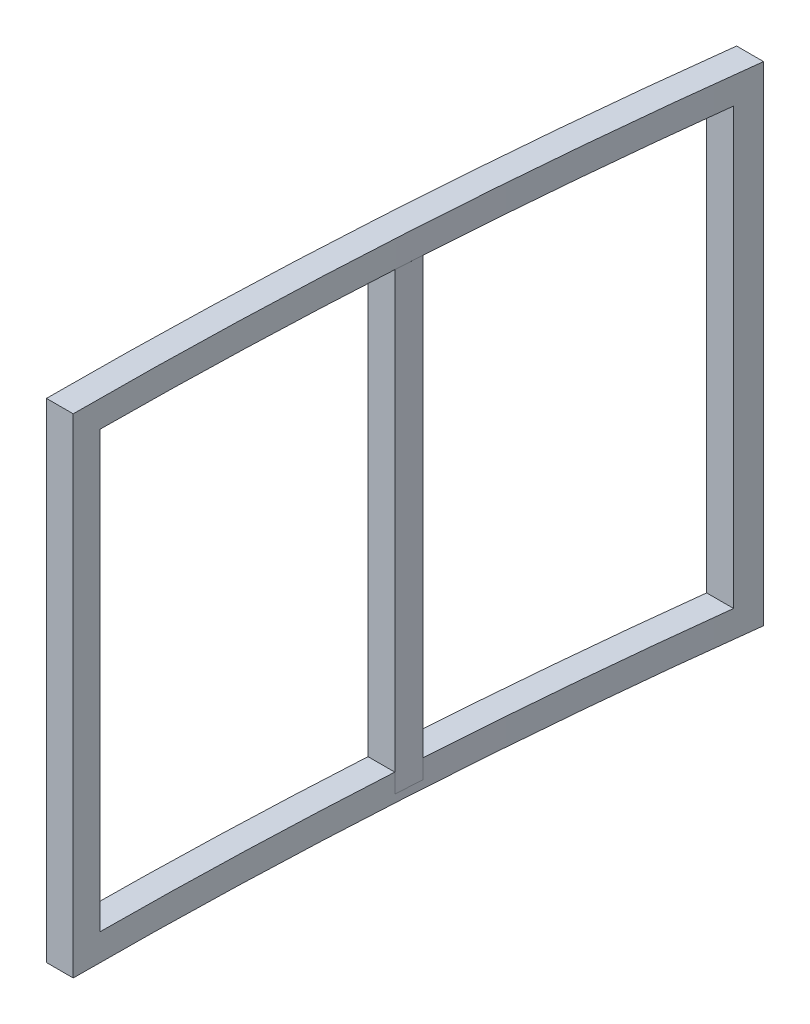
ISO-10303-21;
HEADER;
FILE_DESCRIPTION(('STEP AP214'),'2;1');
FILE_NAME('part.step','',(''),(''),'','','');
FILE_SCHEMA(('AUTOMOTIVE_DESIGN { 1 0 10303 214 1 1 1 1 }'));
ENDSEC;
DATA;
#1=APPLICATION_CONTEXT('core data for automotive mechanical design processes');
#2=APPLICATION_PROTOCOL_DEFINITION('international standard','automotive_design',2000,#1);
#3=PRODUCT_CONTEXT('',#1,'mechanical');
#4=PRODUCT('Part','Part','',(#3));
#5=PRODUCT_RELATED_PRODUCT_CATEGORY('part','',(#4));
#6=PRODUCT_DEFINITION_FORMATION('','',#4);
#7=PRODUCT_DEFINITION_CONTEXT('part definition',#1,'design');
#8=PRODUCT_DEFINITION('design','',#6,#7);
#9=PRODUCT_DEFINITION_SHAPE('','',#8);
#10=(LENGTH_UNIT() NAMED_UNIT(*) SI_UNIT(.MILLI.,.METRE.));
#11=(NAMED_UNIT(*) PLANE_ANGLE_UNIT() SI_UNIT($,.RADIAN.));
#12=(NAMED_UNIT(*) SI_UNIT($,.STERADIAN.) SOLID_ANGLE_UNIT());
#13=UNCERTAINTY_MEASURE_WITH_UNIT(LENGTH_MEASURE(1.E-05),#10,'distance_accuracy_value','');
#14=(GEOMETRIC_REPRESENTATION_CONTEXT(3) GLOBAL_UNCERTAINTY_ASSIGNED_CONTEXT((#13)) GLOBAL_UNIT_ASSIGNED_CONTEXT((#10,
#11,#12)) REPRESENTATION_CONTEXT('',''));
#15=CARTESIAN_POINT('',(0.,0.,0.));
#16=DIRECTION('',(0.,0.,1.));
#17=DIRECTION('',(1.,0.,0.));
#18=AXIS2_PLACEMENT_3D('',#15,#16,#17);
#19=CARTESIAN_POINT('',(0.,914.4,0.));
#20=DIRECTION('',(0.,-1.,0.));
#21=DIRECTION('',(0.,0.,-1.));
#22=AXIS2_PLACEMENT_3D('',#19,#20,#21);
#23=CYLINDRICAL_SURFACE('',#22,9895.75);
#24=CARTESIAN_POINT('',(0.,0.,0.));
#25=DIRECTION('',(0.,-1.,0.));
#26=DIRECTION('',(0.,0.,1.));
#27=AXIS2_PLACEMENT_3D('',#24,#25,#26);
#28=CIRCLE('',#27,9895.75);
#29=CARTESIAN_POINT('',(-9895.75,0.,0.));
#30=VERTEX_POINT('',#29);
#31=CARTESIAN_POINT('',(-9820.64459414395,0.,-1216.88447192459));
#32=VERTEX_POINT('',#31);
#33=EDGE_CURVE('E217',#30,#32,#28,.T.);
#34=ORIENTED_EDGE('',*,*,#33,.T.);
#35=DIRECTION('',(0.,-1.,0.));
#36=VECTOR('',#35,1.);
#37=CARTESIAN_POINT('',(-9820.64459414395,914.4,-1216.88447192459));
#38=LINE('',#37,#36);
#39=CARTESIAN_POINT('',(-9820.64459414395,914.4,-1216.88447192459));
#40=VERTEX_POINT('',#39);
#41=EDGE_CURVE('E244',#40,#32,#38,.T.);
#42=ORIENTED_EDGE('',*,*,#41,.F.);
#43=CARTESIAN_POINT('',(0.,914.4,0.));
#44=DIRECTION('',(0.,-1.,0.));
#45=DIRECTION('',(0.,0.,1.));
#46=AXIS2_PLACEMENT_3D('',#43,#44,#45);
#47=CIRCLE('',#46,9895.75);
#48=CARTESIAN_POINT('',(-9895.75,914.4,0.));
#49=VERTEX_POINT('',#48);
#50=EDGE_CURVE('E218',#49,#40,#47,.T.);
#51=ORIENTED_EDGE('',*,*,#50,.F.);
#52=DIRECTION('',(0.,-1.,0.));
#53=VECTOR('',#52,1.);
#54=CARTESIAN_POINT('',(-9895.75,914.4,0.));
#55=LINE('',#54,#53);
#56=EDGE_CURVE('E228',#49,#30,#55,.T.);
#57=ORIENTED_EDGE('',*,*,#56,.T.);
#58=EDGE_LOOP('',(#34,#42,#51,#57));
#59=FACE_BOUND('',#58,.T.);
#60=DIRECTION('',(0.,1.,0.));
#61=VECTOR('',#60,1.);
#62=CARTESIAN_POINT('',(-9875.38105100254,14.4,-634.6));
#63=LINE('',#62,#61);
#64=CARTESIAN_POINT('',(-9875.3810510025,14.4,-634.600000000652));
#65=VERTEX_POINT('',#64);
#66=CARTESIAN_POINT('',(-9875.38105100259,50.,-634.599999999237));
#67=VERTEX_POINT('',#66);
#68=EDGE_CURVE('E62',#65,#67,#63,.T.);
#69=ORIENTED_EDGE('',*,*,#68,.F.);
#70=CARTESIAN_POINT('',(0.,14.4,0.));
#71=DIRECTION('',(0.,-1.,0.));
#72=DIRECTION('',(0.,0.,-1.));
#73=AXIS2_PLACEMENT_3D('',#70,#71,#72);
#74=CIRCLE('',#73,9895.75);
#75=CARTESIAN_POINT('',(-9878.46703200957,14.4,-584.6));
#76=VERTEX_POINT('',#75);
#77=EDGE_CURVE('E57',#65,#76,#74,.F.);
#78=ORIENTED_EDGE('',*,*,#77,.T.);
#79=DIRECTION('',(0.,1.,0.));
#80=VECTOR('',#79,1.);
#81=CARTESIAN_POINT('',(-9878.46703200957,14.4,-584.6));
#82=LINE('',#81,#80);
#83=CARTESIAN_POINT('',(-9878.46703200957,49.9999999999999,-584.6));
#84=VERTEX_POINT('',#83);
#85=EDGE_CURVE('E187',#76,#84,#82,.T.);
#86=ORIENTED_EDGE('',*,*,#85,.T.);
#87=CARTESIAN_POINT('',(0.,49.9999999999999,0.));
#88=DIRECTION('',(0.,-1.,0.));
#89=DIRECTION('',(0.,0.,-1.));
#90=AXIS2_PLACEMENT_3D('',#87,#88,#89);
#91=CIRCLE('',#90,9895.75);
#92=CARTESIAN_POINT('',(-9895.62368234059,49.9999999999999,-50.));
#93=VERTEX_POINT('',#92);
#94=EDGE_CURVE('E196',#84,#93,#91,.F.);
#95=ORIENTED_EDGE('',*,*,#94,.T.);
#96=DIRECTION('',(0.,-1.,0.));
#97=VECTOR('',#96,1.);
#98=CARTESIAN_POINT('',(-9895.62368234059,914.4,-50.));
#99=LINE('',#98,#97);
#100=CARTESIAN_POINT('',(-9895.62368234059,864.4,-50.));
#101=VERTEX_POINT('',#100);
#102=EDGE_CURVE('E213',#93,#101,#99,.F.);
#103=ORIENTED_EDGE('',*,*,#102,.T.);
#104=CARTESIAN_POINT('',(0.,864.4,0.));
#105=DIRECTION('',(0.,1.,0.));
#106=DIRECTION('',(0.,0.,1.));
#107=AXIS2_PLACEMENT_3D('',#104,#105,#106);
#108=CIRCLE('',#107,9895.75);
#109=CARTESIAN_POINT('',(-9878.46703200957,864.4,-584.6));
#110=VERTEX_POINT('',#109);
#111=EDGE_CURVE('E211',#101,#110,#108,.F.);
#112=ORIENTED_EDGE('',*,*,#111,.T.);
#113=CARTESIAN_POINT('',(-9875.38105100259,864.4,-634.599999999237));
#114=VERTEX_POINT('',#113);
#115=EDGE_CURVE('E214',#110,#114,#108,.F.);
#116=ORIENTED_EDGE('',*,*,#115,.T.);
#117=CARTESIAN_POINT('',(-9826.71098036781,864.4,-1166.88447192459));
#118=VERTEX_POINT('',#117);
#119=EDGE_CURVE('E210',#114,#118,#108,.F.);
#120=ORIENTED_EDGE('',*,*,#119,.T.);
#121=DIRECTION('',(0.,-1.,0.));
#122=VECTOR('',#121,1.);
#123=CARTESIAN_POINT('',(-9826.71098036781,914.4,-1166.88447192459));
#124=LINE('',#123,#122);
#125=CARTESIAN_POINT('',(-9826.71098036781,50.0000000000001,-1166.88447192459));
#126=VERTEX_POINT('',#125);
#127=EDGE_CURVE('E207',#118,#126,#124,.T.);
#128=ORIENTED_EDGE('',*,*,#127,.T.);
#129=EDGE_CURVE('E205',#126,#67,#91,.F.);
#130=ORIENTED_EDGE('',*,*,#129,.T.);
#131=EDGE_LOOP('',(#69,#78,#86,#95,#103,#112,#116,#120,#128,#130));
#132=FACE_BOUND('',#131,.T.);
#133=ADVANCED_FACE('F43',(#59,#132),#23,.F.);
#134=CARTESIAN_POINT('',(-9945.85,864.4,-1166.88447192459));
#135=DIRECTION('',(0.,1.,0.));
#136=DIRECTION('',(0.,0.,1.));
#137=AXIS2_PLACEMENT_3D('',#134,#135,#136);
#138=PLANE('',#137);
#139=DIRECTION('',(1.,0.,0.));
#140=VECTOR('',#139,1.);
#141=CARTESIAN_POINT('',(-9925.58386506809,864.4,-634.6));
#142=LINE('',#141,#140);
#143=CARTESIAN_POINT('',(-9925.58386506809,864.4,-634.6));
#144=VERTEX_POINT('',#143);
#145=EDGE_CURVE('E166',#144,#114,#142,.T.);
#146=ORIENTED_EDGE('',*,*,#145,.F.);
#147=CARTESIAN_POINT('',(0.,864.4,0.));
#148=DIRECTION('',(0.,1.,0.));
#149=DIRECTION('',(0.,0.,1.));
#150=AXIS2_PLACEMENT_3D('',#147,#148,#149);
#151=CIRCLE('',#150,9945.85);
#152=CARTESIAN_POINT('',(-9877.16117372199,864.4,-1166.88447192459));
#153=VERTEX_POINT('',#152);
#154=EDGE_CURVE('E146',#153,#144,#151,.T.);
#155=ORIENTED_EDGE('',*,*,#154,.F.);
#156=DIRECTION('',(1.,0.,0.));
#157=VECTOR('',#156,1.);
#158=CARTESIAN_POINT('',(-9945.85,864.4,-1166.88447192459));
#159=LINE('',#158,#157);
#160=EDGE_CURVE('E197',#153,#118,#159,.T.);
#161=ORIENTED_EDGE('',*,*,#160,.T.);
#162=ORIENTED_EDGE('',*,*,#119,.F.);
#163=EDGE_LOOP('',(#146,#155,#161,#162));
#164=FACE_BOUND('',#163,.T.);
#165=ADVANCED_FACE('F277',(#164),#138,.F.);
#166=DIRECTION('',(0.0612920899743504,0.,-0.998119872413417));
#167=VECTOR('',#166,1.);
#168=CARTESIAN_POINT('',(-9928.65424226768,864.4,-584.6));
#169=LINE('',#168,#167);
#170=CARTESIAN_POINT('',(-9928.65424226768,864.4,-584.6));
#171=VERTEX_POINT('',#170);
#172=EDGE_CURVE('E161',#171,#144,#169,.T.);
#173=ORIENTED_EDGE('',*,*,#172,.F.);
#174=EDGE_CURVE('E137',#144,#171,#151,.T.);
#175=ORIENTED_EDGE('',*,*,#174,.F.);
#176=EDGE_LOOP('',(#173,#175));
#177=FACE_BOUND('',#176,.T.);
#178=ADVANCED_FACE('F163',(#177),#138,.F.);
#179=DIRECTION('',(-1.,0.,0.));
#180=VECTOR('',#179,1.);
#181=CARTESIAN_POINT('',(-9928.65424226768,864.4,-584.6));
#182=LINE('',#181,#180);
#183=EDGE_CURVE('E155',#110,#171,#182,.T.);
#184=ORIENTED_EDGE('',*,*,#183,.F.);
#185=ORIENTED_EDGE('',*,*,#111,.F.);
#186=DIRECTION('',(1.,0.,0.));
#187=VECTOR('',#186,1.);
#188=CARTESIAN_POINT('',(-9945.85,864.4,-50.));
#189=LINE('',#188,#187);
#190=CARTESIAN_POINT('',(-9945.72431864568,864.4,-50.));
#191=VERTEX_POINT('',#190);
#192=EDGE_CURVE('E158',#191,#101,#189,.T.);
#193=ORIENTED_EDGE('',*,*,#192,.F.);
#194=EDGE_CURVE('E143',#171,#191,#151,.T.);
#195=ORIENTED_EDGE('',*,*,#194,.F.);
#196=EDGE_LOOP('',(#184,#185,#193,#195));
#197=FACE_BOUND('',#196,.T.);
#198=ADVANCED_FACE('F153',(#197),#138,.F.);
#199=CARTESIAN_POINT('',(-9945.85,50.,-1166.88447192459));
#200=DIRECTION('',(0.,-1.,0.));
#201=DIRECTION('',(0.,0.,-1.));
#202=AXIS2_PLACEMENT_3D('',#199,#200,#201);
#203=PLANE('',#202);
#204=DIRECTION('',(-1.,0.,0.));
#205=VECTOR('',#204,1.);
#206=CARTESIAN_POINT('',(-9945.85,49.9999999999999,-634.6));
#207=LINE('',#206,#205);
#208=CARTESIAN_POINT('',(-9925.58386506809,50.,-634.6));
#209=VERTEX_POINT('',#208);
#210=EDGE_CURVE('E11',#67,#209,#207,.T.);
#211=ORIENTED_EDGE('',*,*,#210,.F.);
#212=ORIENTED_EDGE('',*,*,#129,.F.);
#213=DIRECTION('',(1.,0.,0.));
#214=VECTOR('',#213,1.);
#215=CARTESIAN_POINT('',(-9945.85,50.,-1166.88447192459));
#216=LINE('',#215,#214);
#217=CARTESIAN_POINT('',(-9877.16117372199,50.0000000000001,-1166.88447192459));
#218=VERTEX_POINT('',#217);
#219=EDGE_CURVE('E200',#218,#126,#216,.T.);
#220=ORIENTED_EDGE('',*,*,#219,.F.);
#221=CARTESIAN_POINT('',(0.,49.9999999999999,0.));
#222=DIRECTION('',(0.,-1.,0.));
#223=DIRECTION('',(0.,0.,-1.));
#224=AXIS2_PLACEMENT_3D('',#221,#222,#223);
#225=CIRCLE('',#224,9945.85);
#226=EDGE_CURVE('E247',#209,#218,#225,.T.);
#227=ORIENTED_EDGE('',*,*,#226,.F.);
#228=EDGE_LOOP('',(#211,#212,#220,#227));
#229=FACE_BOUND('',#228,.T.);
#230=ADVANCED_FACE('F282',(#229),#203,.F.);
#231=DIRECTION('',(-0.0612920899743504,0.,0.998119872413417));
#232=VECTOR('',#231,1.);
#233=CARTESIAN_POINT('',(-9893.09651036196,50.,-1163.64500968892));
#234=LINE('',#233,#232);
#235=CARTESIAN_POINT('',(-9928.65424226768,50.,-584.6));
#236=VERTEX_POINT('',#235);
#237=EDGE_CURVE('E50',#209,#236,#234,.T.);
#238=ORIENTED_EDGE('',*,*,#237,.F.);
#239=EDGE_CURVE('E251',#236,#209,#225,.T.);
#240=ORIENTED_EDGE('',*,*,#239,.F.);
#241=EDGE_LOOP('',(#238,#240));
#242=FACE_BOUND('',#241,.T.);
#243=ADVANCED_FACE('F284',(#242),#203,.F.);
#244=DIRECTION('',(1.,0.,0.));
#245=VECTOR('',#244,1.);
#246=CARTESIAN_POINT('',(-9945.85,49.9999999999999,-584.6));
#247=LINE('',#246,#245);
#248=EDGE_CURVE('E255',#236,#84,#247,.T.);
#249=ORIENTED_EDGE('',*,*,#248,.F.);
#250=CARTESIAN_POINT('',(-9945.72431864568,49.9999999999999,-50.));
#251=VERTEX_POINT('',#250);
#252=EDGE_CURVE('E248',#251,#236,#225,.T.);
#253=ORIENTED_EDGE('',*,*,#252,.F.);
#254=DIRECTION('',(1.,0.,0.));
#255=VECTOR('',#254,1.);
#256=CARTESIAN_POINT('',(-9945.85,49.9999999999999,-50.));
#257=LINE('',#256,#255);
#258=EDGE_CURVE('E194',#251,#93,#257,.T.);
#259=ORIENTED_EDGE('',*,*,#258,.T.);
#260=ORIENTED_EDGE('',*,*,#94,.F.);
#261=EDGE_LOOP('',(#249,#253,#259,#260));
#262=FACE_BOUND('',#261,.T.);
#263=ADVANCED_FACE('F286',(#262),#203,.F.);
#264=CARTESIAN_POINT('',(-9820.64459414395,914.4,-1216.88447192459));
#265=DIRECTION('',(0.,0.,1.));
#266=DIRECTION('',(1.,0.,0.));
#267=AXIS2_PLACEMENT_3D('',#264,#265,#266);
#268=PLANE('',#267);
#269=DIRECTION('',(-1.,0.,0.));
#270=VECTOR('',#269,1.);
#271=CARTESIAN_POINT('',(-9820.64459414395,0.,-1216.88447192459));
#272=LINE('',#271,#270);
#273=CARTESIAN_POINT('',(-9871.12579215202,0.,-1216.88447192459));
#274=VERTEX_POINT('',#273);
#275=EDGE_CURVE('E231',#32,#274,#272,.T.);
#276=ORIENTED_EDGE('',*,*,#275,.T.);
#277=DIRECTION('',(0.,-1.,0.));
#278=VECTOR('',#277,1.);
#279=CARTESIAN_POINT('',(-9871.12579215202,914.4,-1216.88447192459));
#280=LINE('',#279,#278);
#281=CARTESIAN_POINT('',(-9871.12579215202,914.4,-1216.88447192459));
#282=VERTEX_POINT('',#281);
#283=EDGE_CURVE('E241',#282,#274,#280,.T.);
#284=ORIENTED_EDGE('',*,*,#283,.F.);
#285=DIRECTION('',(-1.,0.,0.));
#286=VECTOR('',#285,1.);
#287=CARTESIAN_POINT('',(-9820.64459414395,914.4,-1216.88447192459));
#288=LINE('',#287,#286);
#289=EDGE_CURVE('E221',#40,#282,#288,.T.);
#290=ORIENTED_EDGE('',*,*,#289,.F.);
#291=ORIENTED_EDGE('',*,*,#41,.T.);
#292=EDGE_LOOP('',(#276,#284,#290,#291));
#293=FACE_BOUND('',#292,.T.);
#294=ADVANCED_FACE('F292',(#293),#268,.F.);
#295=CARTESIAN_POINT('',(0.,914.4,0.));
#296=DIRECTION('',(0.,-1.,0.));
#297=DIRECTION('',(0.,0.,-1.));
#298=AXIS2_PLACEMENT_3D('',#295,#296,#297);
#299=CYLINDRICAL_SURFACE('',#298,9945.85);
#300=ORIENTED_EDGE('',*,*,#239,.T.);
#301=ORIENTED_EDGE('',*,*,#226,.T.);
#302=DIRECTION('',(0.,-1.,0.));
#303=VECTOR('',#302,1.);
#304=CARTESIAN_POINT('',(-9877.16117372199,914.4,-1166.88447192459));
#305=LINE('',#304,#303);
#306=EDGE_CURVE('E159',#218,#153,#305,.F.);
#307=ORIENTED_EDGE('',*,*,#306,.T.);
#308=ORIENTED_EDGE('',*,*,#154,.T.);
#309=ORIENTED_EDGE('',*,*,#174,.T.);
#310=ORIENTED_EDGE('',*,*,#194,.T.);
#311=DIRECTION('',(0.,-1.,0.));
#312=VECTOR('',#311,1.);
#313=CARTESIAN_POINT('',(-9945.72431864568,914.4,-50.));
#314=LINE('',#313,#312);
#315=EDGE_CURVE('E253',#191,#251,#314,.T.);
#316=ORIENTED_EDGE('',*,*,#315,.T.);
#317=ORIENTED_EDGE('',*,*,#252,.T.);
#318=EDGE_LOOP('',(#300,#301,#307,#308,#309,#310,#316,#317));
#319=FACE_BOUND('',#318,.T.);
#320=CARTESIAN_POINT('',(0.,0.,0.));
#321=DIRECTION('',(0.,1.,0.));
#322=DIRECTION('',(0.,0.,1.));
#323=AXIS2_PLACEMENT_3D('',#320,#321,#322);
#324=CIRCLE('',#323,9945.85);
#325=CARTESIAN_POINT('',(-9945.85,0.,-1.82702300509496E-12));
#326=VERTEX_POINT('',#325);
#327=EDGE_CURVE('E233',#274,#326,#324,.T.);
#328=ORIENTED_EDGE('',*,*,#327,.T.);
#329=DIRECTION('',(0.,-1.,0.));
#330=VECTOR('',#329,1.);
#331=CARTESIAN_POINT('',(-9945.85,914.4,-1.82702300509496E-12));
#332=LINE('',#331,#330);
#333=CARTESIAN_POINT('',(-9945.85,914.4,-1.82702300509496E-12));
#334=VERTEX_POINT('',#333);
#335=EDGE_CURVE('E238',#334,#326,#332,.T.);
#336=ORIENTED_EDGE('',*,*,#335,.F.);
#337=CARTESIAN_POINT('',(0.,914.4,0.));
#338=DIRECTION('',(0.,1.,0.));
#339=DIRECTION('',(0.,0.,1.));
#340=AXIS2_PLACEMENT_3D('',#337,#338,#339);
#341=CIRCLE('',#340,9945.85);
#342=EDGE_CURVE('E224',#282,#334,#341,.T.);
#343=ORIENTED_EDGE('',*,*,#342,.F.);
#344=ORIENTED_EDGE('',*,*,#283,.T.);
#345=EDGE_LOOP('',(#328,#336,#343,#344));
#346=FACE_BOUND('',#345,.T.);
#347=ADVANCED_FACE('F140',(#319,#346),#299,.T.);
#348=CARTESIAN_POINT('',(-9895.75,914.4,0.));
#349=DIRECTION('',(0.,0.,-1.));
#350=DIRECTION('',(-1.,0.,0.));
#351=AXIS2_PLACEMENT_3D('',#348,#349,#350);
#352=PLANE('',#351);
#353=DIRECTION('',(1.,0.,0.));
#354=VECTOR('',#353,1.);
#355=CARTESIAN_POINT('',(-9895.75,0.,0.));
#356=LINE('',#355,#354);
#357=EDGE_CURVE('E222',#326,#30,#356,.T.);
#358=ORIENTED_EDGE('',*,*,#357,.T.);
#359=ORIENTED_EDGE('',*,*,#56,.F.);
#360=DIRECTION('',(1.,0.,0.));
#361=VECTOR('',#360,1.);
#362=CARTESIAN_POINT('',(-9895.75,914.4,0.));
#363=LINE('',#362,#361);
#364=EDGE_CURVE('E226',#334,#49,#363,.T.);
#365=ORIENTED_EDGE('',*,*,#364,.F.);
#366=ORIENTED_EDGE('',*,*,#335,.T.);
#367=EDGE_LOOP('',(#358,#359,#365,#366));
#368=FACE_BOUND('',#367,.T.);
#369=ADVANCED_FACE('F318',(#368),#352,.F.);
#370=CARTESIAN_POINT('',(0.,914.4,0.));
#371=DIRECTION('',(0.,1.,0.));
#372=DIRECTION('',(0.,0.,1.));
#373=AXIS2_PLACEMENT_3D('',#370,#371,#372);
#374=PLANE('',#373);
#375=ORIENTED_EDGE('',*,*,#50,.T.);
#376=ORIENTED_EDGE('',*,*,#289,.T.);
#377=ORIENTED_EDGE('',*,*,#342,.T.);
#378=ORIENTED_EDGE('',*,*,#364,.T.);
#379=EDGE_LOOP('',(#375,#376,#377,#378));
#380=FACE_BOUND('',#379,.T.);
#381=ADVANCED_FACE('F314',(#380),#374,.T.);
#382=CARTESIAN_POINT('',(0.,0.,0.));
#383=DIRECTION('',(0.,1.,0.));
#384=DIRECTION('',(0.,0.,1.));
#385=AXIS2_PLACEMENT_3D('',#382,#383,#384);
#386=PLANE('',#385);
#387=ORIENTED_EDGE('',*,*,#33,.F.);
#388=ORIENTED_EDGE('',*,*,#357,.F.);
#389=ORIENTED_EDGE('',*,*,#327,.F.);
#390=ORIENTED_EDGE('',*,*,#275,.F.);
#391=EDGE_LOOP('',(#387,#388,#389,#390));
#392=FACE_BOUND('',#391,.T.);
#393=ADVANCED_FACE('F308',(#392),#386,.F.);
#394=CARTESIAN_POINT('',(-9945.85,864.4,-50.));
#395=DIRECTION('',(0.,0.,1.));
#396=DIRECTION('',(1.,0.,0.));
#397=AXIS2_PLACEMENT_3D('',#394,#395,#396);
#398=PLANE('',#397);
#399=ORIENTED_EDGE('',*,*,#258,.F.);
#400=ORIENTED_EDGE('',*,*,#315,.F.);
#401=ORIENTED_EDGE('',*,*,#192,.T.);
#402=ORIENTED_EDGE('',*,*,#102,.F.);
#403=EDGE_LOOP('',(#399,#400,#401,#402));
#404=FACE_BOUND('',#403,.T.);
#405=ADVANCED_FACE('F330',(#404),#398,.F.);
#406=CARTESIAN_POINT('',(-9945.85,864.4,-1166.88447192459));
#407=DIRECTION('',(0.,0.,-1.));
#408=DIRECTION('',(-1.,0.,0.));
#409=AXIS2_PLACEMENT_3D('',#406,#407,#408);
#410=PLANE('',#409);
#411=ORIENTED_EDGE('',*,*,#160,.F.);
#412=ORIENTED_EDGE('',*,*,#306,.F.);
#413=ORIENTED_EDGE('',*,*,#219,.T.);
#414=ORIENTED_EDGE('',*,*,#127,.F.);
#415=EDGE_LOOP('',(#411,#412,#413,#414));
#416=FACE_BOUND('',#415,.T.);
#417=ADVANCED_FACE('F274',(#416),#410,.F.);
#418=CARTESIAN_POINT('',(-9928.65424226768,14.4,-584.6));
#419=DIRECTION('',(0.998119872413417,0.,0.0612920899743504));
#420=DIRECTION('',(0.0612920899743504,0.,-0.998119872413417));
#421=AXIS2_PLACEMENT_3D('',#418,#419,#420);
#422=PLANE('',#421);
#423=DIRECTION('',(0.,1.,0.));
#424=VECTOR('',#423,1.);
#425=CARTESIAN_POINT('',(-9925.58386506809,14.4,-634.6));
#426=LINE('',#425,#424);
#427=EDGE_CURVE('E191',#209,#144,#426,.T.);
#428=ORIENTED_EDGE('',*,*,#427,.F.);
#429=ORIENTED_EDGE('',*,*,#237,.T.);
#430=DIRECTION('',(0.,1.,0.));
#431=VECTOR('',#430,1.);
#432=CARTESIAN_POINT('',(-9928.65424226768,14.4,-584.6));
#433=LINE('',#432,#431);
#434=EDGE_CURVE('E170',#236,#171,#433,.T.);
#435=ORIENTED_EDGE('',*,*,#434,.T.);
#436=ORIENTED_EDGE('',*,*,#172,.T.);
#437=EDGE_LOOP('',(#428,#429,#435,#436));
#438=FACE_BOUND('',#437,.T.);
#439=ADVANCED_FACE('F171',(#438),#422,.F.);
#440=CARTESIAN_POINT('',(-9925.58386506809,14.4,-634.6));
#441=DIRECTION('',(0.,0.,1.));
#442=DIRECTION('',(0.,-1.,0.));
#443=AXIS2_PLACEMENT_3D('',#440,#441,#442);
#444=PLANE('',#443);
#445=EDGE_CURVE('E189',#67,#114,#63,.T.);
#446=ORIENTED_EDGE('',*,*,#445,.F.);
#447=ORIENTED_EDGE('',*,*,#210,.T.);
#448=ORIENTED_EDGE('',*,*,#427,.T.);
#449=ORIENTED_EDGE('',*,*,#145,.T.);
#450=EDGE_LOOP('',(#446,#447,#448,#449));
#451=FACE_BOUND('',#450,.T.);
#452=ADVANCED_FACE('F279',(#451),#444,.F.);
#453=CARTESIAN_POINT('',(-9928.65424226768,14.4,-584.6));
#454=DIRECTION('',(0.,0.,-1.));
#455=DIRECTION('',(0.,1.,0.));
#456=AXIS2_PLACEMENT_3D('',#453,#454,#455);
#457=PLANE('',#456);
#458=ORIENTED_EDGE('',*,*,#434,.F.);
#459=ORIENTED_EDGE('',*,*,#248,.T.);
#460=EDGE_CURVE('E174',#84,#110,#82,.T.);
#461=ORIENTED_EDGE('',*,*,#460,.T.);
#462=ORIENTED_EDGE('',*,*,#183,.T.);
#463=EDGE_LOOP('',(#458,#459,#461,#462));
#464=FACE_BOUND('',#463,.T.);
#465=ADVANCED_FACE('F178',(#464),#457,.F.);
#466=CARTESIAN_POINT('',(-9878.46703200957,14.4,-584.6));
#467=DIRECTION('',(-0.998100768598681,0.,-0.0616024003000014));
#468=DIRECTION('',(-0.0616024003000014,0.,0.998100768598681));
#469=AXIS2_PLACEMENT_3D('',#466,#467,#468);
#470=PLANE('',#469);
#471=DIRECTION('',(-0.0616024003000014,0.,0.998100768598681));
#472=VECTOR('',#471,1.);
#473=CARTESIAN_POINT('',(-9878.46703200957,864.4,-584.6));
#474=LINE('',#473,#472);
#475=EDGE_CURVE('E181',#114,#110,#474,.T.);
#476=ORIENTED_EDGE('',*,*,#475,.T.);
#477=ORIENTED_EDGE('',*,*,#460,.F.);
#478=ORIENTED_EDGE('',*,*,#85,.F.);
#479=DIRECTION('',(-0.0616024003000014,0.,0.998100768598681));
#480=VECTOR('',#479,1.);
#481=CARTESIAN_POINT('',(-9878.46703200957,14.4,-584.6));
#482=LINE('',#481,#480);
#483=EDGE_CURVE('E175',#65,#76,#482,.T.);
#484=ORIENTED_EDGE('',*,*,#483,.F.);
#485=ORIENTED_EDGE('',*,*,#68,.T.);
#486=ORIENTED_EDGE('',*,*,#445,.T.);
#487=EDGE_LOOP('',(#476,#477,#478,#484,#485,#486));
#488=FACE_BOUND('',#487,.T.);
#489=ADVANCED_FACE('F260',(#488),#470,.F.);
#490=CARTESIAN_POINT('',(0.,14.4,0.));
#491=DIRECTION('',(0.,-1.,0.));
#492=DIRECTION('',(0.,0.,-1.));
#493=AXIS2_PLACEMENT_3D('',#490,#491,#492);
#494=PLANE('',#493);
#495=ORIENTED_EDGE('',*,*,#77,.F.);
#496=ORIENTED_EDGE('',*,*,#483,.T.);
#497=EDGE_LOOP('',(#495,#496));
#498=FACE_BOUND('',#497,.T.);
#499=ADVANCED_FACE('F346',(#498),#494,.T.);
#500=CARTESIAN_POINT('',(0.,864.4,0.));
#501=DIRECTION('',(0.,-1.,0.));
#502=DIRECTION('',(0.,0.,-1.));
#503=AXIS2_PLACEMENT_3D('',#500,#501,#502);
#504=PLANE('',#503);
#505=ORIENTED_EDGE('',*,*,#475,.F.);
#506=ORIENTED_EDGE('',*,*,#115,.F.);
#507=EDGE_LOOP('',(#505,#506));
#508=FACE_BOUND('',#507,.T.);
#509=ADVANCED_FACE('F268',(#508),#504,.F.);
#510=CLOSED_SHELL('',(#133,#165,#178,#198,#230,#243,#263,#294,#347,#369,#381,#393,#405,#417,
#439,#452,#465,#489,#499,#509));
#511=MANIFOLD_SOLID_BREP('B2',#510);
#512=ADVANCED_BREP_SHAPE_REPRESENTATION('',(#18,#511),#14);
#513=SHAPE_DEFINITION_REPRESENTATION(#9,#512);
ENDSEC;
END-ISO-10303-21;
